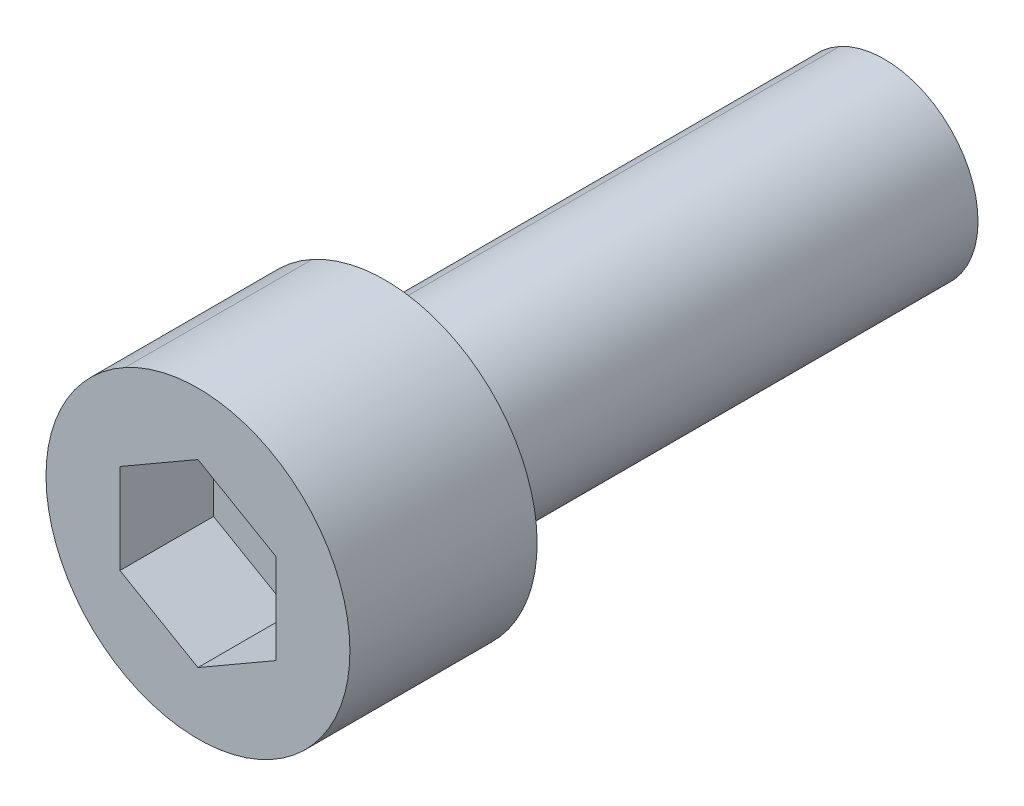
ISO-10303-21;
HEADER;
FILE_DESCRIPTION(('STEP AP214'),'2;1');
FILE_NAME('part.step','',(''),(''),'','','');
FILE_SCHEMA(('AUTOMOTIVE_DESIGN { 1 0 10303 214 1 1 1 1 }'));
ENDSEC;
DATA;
#1=APPLICATION_CONTEXT('core data for automotive mechanical design processes');
#2=APPLICATION_PROTOCOL_DEFINITION('international standard','automotive_design',2000,#1);
#3=PRODUCT_CONTEXT('',#1,'mechanical');
#4=PRODUCT('Part','Part','',(#3));
#5=PRODUCT_RELATED_PRODUCT_CATEGORY('part','',(#4));
#6=PRODUCT_DEFINITION_FORMATION('','',#4);
#7=PRODUCT_DEFINITION_CONTEXT('part definition',#1,'design');
#8=PRODUCT_DEFINITION('design','',#6,#7);
#9=PRODUCT_DEFINITION_SHAPE('','',#8);
#10=(LENGTH_UNIT() NAMED_UNIT(*) SI_UNIT(.MILLI.,.METRE.));
#11=(NAMED_UNIT(*) PLANE_ANGLE_UNIT() SI_UNIT($,.RADIAN.));
#12=(NAMED_UNIT(*) SI_UNIT($,.STERADIAN.) SOLID_ANGLE_UNIT());
#13=UNCERTAINTY_MEASURE_WITH_UNIT(LENGTH_MEASURE(1.E-05),#10,'distance_accuracy_value','');
#14=(GEOMETRIC_REPRESENTATION_CONTEXT(3) GLOBAL_UNCERTAINTY_ASSIGNED_CONTEXT((#13)) GLOBAL_UNIT_ASSIGNED_CONTEXT((#10,
#11,#12)) REPRESENTATION_CONTEXT('',''));
#15=CARTESIAN_POINT('',(0.,0.,0.));
#16=DIRECTION('',(0.,0.,1.));
#17=DIRECTION('',(1.,0.,0.));
#18=AXIS2_PLACEMENT_3D('',#15,#16,#17);
#19=CARTESIAN_POINT('',(0.,0.,779.5));
#20=DIRECTION('',(0.,0.,1.));
#21=DIRECTION('',(1.,0.,0.));
#22=AXIS2_PLACEMENT_3D('',#19,#20,#21);
#23=PLANE('',#22);
#24=CARTESIAN_POINT('',(213.4677415,-218.0155742,779.5));
#25=DIRECTION('',(-0.866025399730553,0.500000007021536,0.));
#26=VECTOR('',#25,1.);
#27=LINE('',#24,#26);
#28=CARTESIAN_POINT('',(213.467741506874,-218.015574188094,779.5));
#29=VERTEX_POINT('',#28);
#30=CARTESIAN_POINT('',(210.967741501666,-216.5721984926,779.5));
#31=VERTEX_POINT('',#30);
#32=EDGE_CURVE('E126',#29,#31,#27,.T.);
#33=ORIENTED_EDGE('',*,*,#32,.T.);
#34=CARTESIAN_POINT('',(210.9677415,-216.5721985,779.5));
#35=DIRECTION('',(-0.866025399730553,-0.500000007021536,0.));
#36=VECTOR('',#35,1.);
#37=LINE('',#34,#36);
#38=CARTESIAN_POINT('',(208.467741494793,-218.01557419098,779.5));
#39=VERTEX_POINT('',#38);
#40=EDGE_CURVE('E262',#31,#39,#37,.T.);
#41=ORIENTED_EDGE('',*,*,#40,.T.);
#42=CARTESIAN_POINT('',(208.4677415,-218.0155742,779.5));
#43=DIRECTION('',(0.,-1.,0.));
#44=VECTOR('',#43,1.);
#45=LINE('',#42,#44);
#46=CARTESIAN_POINT('',(208.46774150025,-220.902325499568,779.5));
#47=VERTEX_POINT('',#46);
#48=EDGE_CURVE('E221',#39,#47,#45,.T.);
#49=ORIENTED_EDGE('',*,*,#48,.T.);
#50=CARTESIAN_POINT('',(208.4677415,-220.9023255,779.5));
#51=DIRECTION('',(0.866025399730553,-0.500000007021536,0.));
#52=VECTOR('',#51,1.);
#53=LINE('',#50,#52);
#54=CARTESIAN_POINT('',(210.967741501666,-222.345701188497,779.5));
#55=VERTEX_POINT('',#54);
#56=EDGE_CURVE('E111',#47,#55,#53,.T.);
#57=ORIENTED_EDGE('',*,*,#56,.T.);
#58=CARTESIAN_POINT('',(210.9677415,-222.3457012,779.5));
#59=DIRECTION('',(0.866025399730553,0.500000007021536,0.));
#60=VECTOR('',#59,1.);
#61=LINE('',#58,#60);
#62=CARTESIAN_POINT('',(213.467741501418,-220.902325502455,779.5));
#63=VERTEX_POINT('',#62);
#64=EDGE_CURVE('E104',#55,#63,#61,.T.);
#65=ORIENTED_EDGE('',*,*,#64,.T.);
#66=CARTESIAN_POINT('',(213.4677415,-220.9023255,779.5));
#67=DIRECTION('',(0.,1.,0.));
#68=VECTOR('',#67,1.);
#69=LINE('',#66,#68);
#70=EDGE_CURVE('E90',#63,#29,#69,.T.);
#71=ORIENTED_EDGE('',*,*,#70,.T.);
#72=EDGE_LOOP('',(#33,#41,#49,#57,#65,#71));
#73=FACE_BOUND('',#72,.T.);
#74=ADVANCED_FACE('F14',(#73),#23,.T.);
#75=CARTESIAN_POINT('',(0.,-344.147983525931,0.));
#76=DIRECTION('',(-0.499999999993262,0.866025403788329,0.));
#77=DIRECTION('',(0.,0.,1.));
#78=AXIS2_PLACEMENT_3D('',#75,#76,#77);
#79=PLANE('',#78);
#80=CARTESIAN_POINT('',(210.967741492538,-222.345701187075,782.5));
#81=DIRECTION('',(0.866025403788331,0.499999999993259,0.));
#82=VECTOR('',#81,1.);
#83=LINE('',#80,#82);
#84=CARTESIAN_POINT('',(210.967741501666,-222.345701188497,782.5));
#85=VERTEX_POINT('',#84);
#86=CARTESIAN_POINT('',(213.467741501418,-220.902325502455,782.5));
#87=VERTEX_POINT('',#86);
#88=EDGE_CURVE('E123',#85,#87,#83,.T.);
#89=ORIENTED_EDGE('',*,*,#88,.T.);
#90=CARTESIAN_POINT('',(213.467741504252,-220.902325507364,782.5));
#91=DIRECTION('',(0.,0.,-1.));
#92=VECTOR('',#91,1.);
#93=LINE('',#90,#92);
#94=EDGE_CURVE('E96',#87,#63,#93,.T.);
#95=ORIENTED_EDGE('',*,*,#94,.T.);
#96=ORIENTED_EDGE('',*,*,#64,.F.);
#97=CARTESIAN_POINT('',(210.967741492538,-222.345701187075,779.5));
#98=DIRECTION('',(0.,0.,1.));
#99=VECTOR('',#98,1.);
#100=LINE('',#97,#99);
#101=EDGE_CURVE('E155',#55,#85,#100,.T.);
#102=ORIENTED_EDGE('',*,*,#101,.T.);
#103=EDGE_LOOP('',(#89,#95,#96,#102));
#104=FACE_BOUND('',#103,.T.);
#105=ADVANCED_FACE('F122',(#104),#79,.T.);
#106=CARTESIAN_POINT('',(213.4677415,0.,0.));
#107=DIRECTION('',(-1.,0.,0.));
#108=DIRECTION('',(0.,0.,1.));
#109=AXIS2_PLACEMENT_3D('',#106,#107,#108);
#110=PLANE('',#109);
#111=CARTESIAN_POINT('',(213.4677415,-220.9023255,782.5));
#112=DIRECTION('',(0.,1.,0.));
#113=VECTOR('',#112,1.);
#114=LINE('',#111,#113);
#115=CARTESIAN_POINT('',(213.467741506874,-218.015574188094,782.5));
#116=VERTEX_POINT('',#115);
#117=EDGE_CURVE('E346',#87,#116,#114,.T.);
#118=ORIENTED_EDGE('',*,*,#117,.T.);
#119=CARTESIAN_POINT('',(213.4677415,-218.0155742,782.5));
#120=DIRECTION('',(0.,0.,-1.));
#121=VECTOR('',#120,1.);
#122=LINE('',#119,#121);
#123=EDGE_CURVE('E99',#116,#29,#122,.T.);
#124=ORIENTED_EDGE('',*,*,#123,.T.);
#125=ORIENTED_EDGE('',*,*,#70,.F.);
#126=ORIENTED_EDGE('',*,*,#94,.F.);
#127=EDGE_LOOP('',(#118,#124,#125,#126));
#128=FACE_BOUND('',#127,.T.);
#129=ADVANCED_FACE('F94',(#128),#110,.T.);
#130=CARTESIAN_POINT('',(0.,-94.7699161362638,0.));
#131=DIRECTION('',(-0.499999999993262,-0.866025403788329,0.));
#132=DIRECTION('',(0.,0.,1.));
#133=AXIS2_PLACEMENT_3D('',#130,#131,#132);
#134=PLANE('',#133);
#135=CARTESIAN_POINT('',(213.467741520622,-218.015574164282,782.5));
#136=DIRECTION('',(-0.866025403788329,0.499999999993261,0.));
#137=VECTOR('',#136,1.);
#138=LINE('',#135,#137);
#139=CARTESIAN_POINT('',(210.967741501666,-216.5721984926,782.5));
#140=VERTEX_POINT('',#139);
#141=EDGE_CURVE('E327',#116,#140,#138,.T.);
#142=ORIENTED_EDGE('',*,*,#141,.T.);
#143=CARTESIAN_POINT('',(210.967741508908,-216.572198484571,782.5));
#144=DIRECTION('',(0.,0.,-1.));
#145=VECTOR('',#144,1.);
#146=LINE('',#143,#145);
#147=EDGE_CURVE('E295',#140,#31,#146,.T.);
#148=ORIENTED_EDGE('',*,*,#147,.T.);
#149=ORIENTED_EDGE('',*,*,#32,.F.);
#150=ORIENTED_EDGE('',*,*,#123,.F.);
#151=EDGE_LOOP('',(#142,#148,#149,#150));
#152=FACE_BOUND('',#151,.T.);
#153=ADVANCED_FACE('F275',(#152),#134,.T.);
#154=CARTESIAN_POINT('',(0.,-338.374480834138,0.));
#155=DIRECTION('',(0.499999999993262,-0.866025403788329,0.));
#156=DIRECTION('',(0.,0.,-1.));
#157=AXIS2_PLACEMENT_3D('',#154,#155,#156);
#158=PLANE('',#157);
#159=CARTESIAN_POINT('',(210.967741496092,-216.572198493231,782.5));
#160=DIRECTION('',(-0.866025403788327,-0.499999999993266,0.));
#161=VECTOR('',#160,1.);
#162=LINE('',#159,#161);
#163=CARTESIAN_POINT('',(208.467741494793,-218.01557419098,782.5));
#164=VERTEX_POINT('',#163);
#165=EDGE_CURVE('E348',#140,#164,#162,.T.);
#166=ORIENTED_EDGE('',*,*,#165,.T.);
#167=CARTESIAN_POINT('',(208.467741484378,-218.015574172942,782.5));
#168=DIRECTION('',(0.,0.,-1.));
#169=VECTOR('',#168,1.);
#170=LINE('',#167,#169);
#171=EDGE_CURVE('E251',#164,#39,#170,.T.);
#172=ORIENTED_EDGE('',*,*,#171,.T.);
#173=ORIENTED_EDGE('',*,*,#40,.F.);
#174=ORIENTED_EDGE('',*,*,#147,.F.);
#175=EDGE_LOOP('',(#166,#172,#173,#174));
#176=FACE_BOUND('',#175,.T.);
#177=ADVANCED_FACE('F267',(#176),#158,.T.);
#178=CARTESIAN_POINT('',(208.4677415,0.,0.));
#179=DIRECTION('',(1.,0.,0.));
#180=DIRECTION('',(0.,0.,-1.));
#181=AXIS2_PLACEMENT_3D('',#178,#179,#180);
#182=PLANE('',#181);
#183=CARTESIAN_POINT('',(208.4677415,-218.0155742,782.5));
#184=DIRECTION('',(0.,-1.,0.));
#185=VECTOR('',#184,1.);
#186=LINE('',#183,#185);
#187=CARTESIAN_POINT('',(208.46774150025,-220.902325499568,782.5));
#188=VERTEX_POINT('',#187);
#189=EDGE_CURVE('E180',#164,#188,#186,.T.);
#190=ORIENTED_EDGE('',*,*,#189,.T.);
#191=CARTESIAN_POINT('',(208.4677415,-220.9023255,782.5));
#192=DIRECTION('',(0.,0.,-1.));
#193=VECTOR('',#192,1.);
#194=LINE('',#191,#193);
#195=EDGE_CURVE('E167',#188,#47,#194,.T.);
#196=ORIENTED_EDGE('',*,*,#195,.T.);
#197=ORIENTED_EDGE('',*,*,#48,.F.);
#198=ORIENTED_EDGE('',*,*,#171,.F.);
#199=EDGE_LOOP('',(#190,#196,#197,#198));
#200=FACE_BOUND('',#199,.T.);
#201=ADVANCED_FACE('F199',(#200),#182,.T.);
#202=CARTESIAN_POINT('',(0.,-100.543418828056,0.));
#203=DIRECTION('',(0.499999999993262,0.866025403788329,0.));
#204=DIRECTION('',(0.,0.,-1.));
#205=AXIS2_PLACEMENT_3D('',#202,#203,#204);
#206=PLANE('',#205);
#207=CARTESIAN_POINT('',(208.467741500748,-220.902325498704,782.5));
#208=DIRECTION('',(0.866025403788328,-0.499999999993263,0.));
#209=VECTOR('',#208,1.);
#210=LINE('',#207,#209);
#211=EDGE_CURVE('E169',#188,#85,#210,.T.);
#212=ORIENTED_EDGE('',*,*,#211,.T.);
#213=ORIENTED_EDGE('',*,*,#101,.F.);
#214=ORIENTED_EDGE('',*,*,#56,.F.);
#215=ORIENTED_EDGE('',*,*,#195,.F.);
#216=EDGE_LOOP('',(#212,#213,#214,#215));
#217=FACE_BOUND('',#216,.T.);
#218=ADVANCED_FACE('F171',(#217),#206,.T.);
#219=CARTESIAN_POINT('',(0.,0.,782.5));
#220=DIRECTION('',(0.,0.,1.));
#221=DIRECTION('',(1.,0.,0.));
#222=AXIS2_PLACEMENT_3D('',#219,#220,#221);
#223=PLANE('',#222);
#224=ORIENTED_EDGE('',*,*,#189,.F.);
#225=ORIENTED_EDGE('',*,*,#165,.F.);
#226=ORIENTED_EDGE('',*,*,#141,.F.);
#227=ORIENTED_EDGE('',*,*,#117,.F.);
#228=ORIENTED_EDGE('',*,*,#88,.F.);
#229=ORIENTED_EDGE('',*,*,#211,.F.);
#230=EDGE_LOOP('',(#224,#225,#226,#227,#228,#229));
#231=FACE_BOUND('',#230,.T.);
#232=CARTESIAN_POINT('',(210.9677415,-219.4589499,782.5));
#233=DIRECTION('',(0.,0.,-1.));
#234=DIRECTION('',(0.479425538596923,-0.87758256189435,0.));
#235=AXIS2_PLACEMENT_3D('',#232,#233,#234);
#236=CIRCLE('',#235,4.86999998570629);
#237=CARTESIAN_POINT('',(208.632939171016,-215.185122825516,782.5));
#238=VERTEX_POINT('',#237);
#239=CARTESIAN_POINT('',(213.302543888528,-223.732776941955,782.5));
#240=VERTEX_POINT('',#239);
#241=EDGE_CURVE('E727',#238,#240,#236,.F.);
#242=ORIENTED_EDGE('',*,*,#241,.T.);
#243=CARTESIAN_POINT('',(210.9677415,-219.4589499,782.5));
#244=DIRECTION('',(0.,0.,-1.));
#245=DIRECTION('',(-0.479425538596918,0.877582561894353,0.));
#246=AXIS2_PLACEMENT_3D('',#243,#244,#245);
#247=CIRCLE('',#246,4.86999994589062);
#248=EDGE_CURVE('E179',#240,#238,#247,.F.);
#249=ORIENTED_EDGE('',*,*,#248,.T.);
#250=EDGE_LOOP('',(#242,#249));
#251=FACE_BOUND('',#250,.T.);
#252=ADVANCED_FACE('F198',(#231,#251),#223,.T.);
#253=CARTESIAN_POINT('',(213.3025439,-223.7327769,776.5));
#254=CARTESIAN_POINT('',(213.3025439,-223.7327769,782.5));
#255=(BOUNDED_CURVE() B_SPLINE_CURVE(1,(#253,#254),.UNSPECIFIED.,.F.,
.F.) B_SPLINE_CURVE_WITH_KNOTS((2,2),(0.,1.),
.UNSPECIFIED.) CURVE() GEOMETRIC_REPRESENTATION_ITEM() RATIONAL_B_SPLINE_CURVE((1.,1.)) REPRESENTATION_ITEM(''));
#256=CARTESIAN_POINT('',(210.9677415,-219.4589499,771.5));
#257=DIRECTION('',(0.,0.,1.));
#258=AXIS1_PLACEMENT('',#256,#257);
#259=SURFACE_OF_REVOLUTION('',#255,#258);
#260=ORIENTED_EDGE('',*,*,#248,.F.);
#261=CARTESIAN_POINT('',(213.3025439,-223.7327769,782.5));
#262=CARTESIAN_POINT('',(213.3025439,-223.7327769,782.25));
#263=CARTESIAN_POINT('',(213.3025439,-223.7327769,782.));
#264=CARTESIAN_POINT('',(213.3025439,-223.7327769,781.5));
#265=CARTESIAN_POINT('',(213.3025439,-223.7327769,781.25));
#266=CARTESIAN_POINT('',(213.3025439,-223.7327769,780.75));
#267=CARTESIAN_POINT('',(213.3025439,-223.7327769,780.5));
#268=CARTESIAN_POINT('',(213.3025439,-223.7327769,780.));
#269=CARTESIAN_POINT('',(213.3025439,-223.7327769,779.75));
#270=CARTESIAN_POINT('',(213.3025439,-223.7327769,779.25));
#271=CARTESIAN_POINT('',(213.3025439,-223.7327769,779.));
#272=CARTESIAN_POINT('',(213.3025439,-223.7327769,778.5));
#273=CARTESIAN_POINT('',(213.3025439,-223.7327769,778.25));
#274=CARTESIAN_POINT('',(213.3025439,-223.7327769,777.75));
#275=CARTESIAN_POINT('',(213.3025439,-223.7327769,777.5));
#276=CARTESIAN_POINT('',(213.3025439,-223.7327769,777.));
#277=CARTESIAN_POINT('',(213.3025439,-223.7327769,776.75));
#278=CARTESIAN_POINT('',(213.3025439,-223.7327769,776.5));
#279=B_SPLINE_CURVE_WITH_KNOTS('',3,(#261,#262,#263,#264,#265,#266,#267,#268,#269,#270,#271,
#272,#273,#274,#275,#276,#277,#278),.UNSPECIFIED.,.F.,.F.,(4,2,2,2,2,2,2,2,4),(0.,
0.750000000000028,1.49999999999995,2.25000000000009,3.,3.74999999999992,4.49999999999995,
5.25000000000009,6.00000000000001),.UNSPECIFIED.);
#280=CARTESIAN_POINT('',(213.302543888528,-223.732776941955,776.5));
#281=VERTEX_POINT('',#280);
#282=EDGE_CURVE('E695',#240,#281,#279,.T.);
#283=ORIENTED_EDGE('',*,*,#282,.T.);
#284=CARTESIAN_POINT('',(210.9677415,-219.4589499,776.5));
#285=DIRECTION('',(0.,0.,1.));
#286=DIRECTION('',(0.479425549474623,-0.877582555951835,0.));
#287=AXIS2_PLACEMENT_3D('',#284,#285,#286);
#288=CIRCLE('',#287,4.86999994589064);
#289=CARTESIAN_POINT('',(208.632939171016,-215.185122825516,776.5));
#290=VERTEX_POINT('',#289);
#291=EDGE_CURVE('E687',#281,#290,#288,.T.);
#292=ORIENTED_EDGE('',*,*,#291,.T.);
#293=CARTESIAN_POINT('',(208.632939219089,-215.185122834942,776.5));
#294=CARTESIAN_POINT('',(208.632939219089,-215.185122834942,776.75));
#295=CARTESIAN_POINT('',(208.632939219089,-215.185122834942,777.));
#296=CARTESIAN_POINT('',(208.632939219089,-215.185122834942,777.5));
#297=CARTESIAN_POINT('',(208.632939219089,-215.185122834942,777.75));
#298=CARTESIAN_POINT('',(208.632939219089,-215.185122834942,778.25));
#299=CARTESIAN_POINT('',(208.632939219089,-215.185122834942,778.5));
#300=CARTESIAN_POINT('',(208.632939219089,-215.185122834942,779.));
#301=CARTESIAN_POINT('',(208.632939219089,-215.185122834942,779.25));
#302=CARTESIAN_POINT('',(208.632939219089,-215.185122834942,779.75));
#303=CARTESIAN_POINT('',(208.632939219089,-215.185122834942,780.));
#304=CARTESIAN_POINT('',(208.632939219089,-215.185122834942,780.5));
#305=CARTESIAN_POINT('',(208.632939219089,-215.185122834942,780.75));
#306=CARTESIAN_POINT('',(208.632939219089,-215.185122834942,781.25));
#307=CARTESIAN_POINT('',(208.632939219089,-215.185122834942,781.5));
#308=CARTESIAN_POINT('',(208.632939219089,-215.185122834942,782.));
#309=CARTESIAN_POINT('',(208.632939219089,-215.185122834942,782.25));
#310=CARTESIAN_POINT('',(208.632939219089,-215.185122834942,782.5));
#311=B_SPLINE_CURVE_WITH_KNOTS('',3,(#293,#294,#295,#296,#297,#298,#299,#300,#301,#302,#303,
#304,#305,#306,#307,#308,#309,#310),.UNSPECIFIED.,.F.,.F.,(4,2,2,2,2,2,2,2,4),(0.,
0.749999999999917,1.50000000000006,2.25000000000009,3.,3.74999999999992,4.50000000000006,
5.24999999999998,6.00000000000001),.UNSPECIFIED.);
#312=EDGE_CURVE('E736',#290,#238,#311,.T.);
#313=ORIENTED_EDGE('',*,*,#312,.T.);
#314=EDGE_LOOP('',(#260,#283,#292,#313));
#315=FACE_BOUND('',#314,.T.);
#316=ADVANCED_FACE('F535',(#315),#259,.T.);
#317=CARTESIAN_POINT('',(208.6329392,-215.1851228,776.5));
#318=CARTESIAN_POINT('',(208.6329392,-215.1851228,782.5));
#319=(BOUNDED_CURVE() B_SPLINE_CURVE(1,(#317,#318),.UNSPECIFIED.,.F.,
.F.) B_SPLINE_CURVE_WITH_KNOTS((2,2),(0.,1.),
.UNSPECIFIED.) CURVE() GEOMETRIC_REPRESENTATION_ITEM() RATIONAL_B_SPLINE_CURVE((1.,1.)) REPRESENTATION_ITEM(''));
#320=CARTESIAN_POINT('',(210.9677415,-219.4589499,771.5));
#321=DIRECTION('',(0.,0.,1.));
#322=AXIS1_PLACEMENT('',#320,#321);
#323=SURFACE_OF_REVOLUTION('',#319,#322);
#324=ORIENTED_EDGE('',*,*,#241,.F.);
#325=ORIENTED_EDGE('',*,*,#312,.F.);
#326=CARTESIAN_POINT('',(210.9677415,-219.4589499,776.5));
#327=DIRECTION('',(0.,0.,1.));
#328=DIRECTION('',(-0.479425525021101,0.877582569310855,0.));
#329=AXIS2_PLACEMENT_3D('',#326,#327,#328);
#330=CIRCLE('',#329,4.8699999857063);
#331=EDGE_CURVE('E670',#290,#281,#330,.T.);
#332=ORIENTED_EDGE('',*,*,#331,.T.);
#333=ORIENTED_EDGE('',*,*,#282,.F.);
#334=EDGE_LOOP('',(#324,#325,#332,#333));
#335=FACE_BOUND('',#334,.T.);
#336=ADVANCED_FACE('F547',(#335),#323,.T.);
#337=CARTESIAN_POINT('',(0.,0.,760.5));
#338=DIRECTION('',(0.,0.,1.));
#339=DIRECTION('',(1.,0.,0.));
#340=AXIS2_PLACEMENT_3D('',#337,#338,#339);
#341=PLANE('',#340);
#342=CARTESIAN_POINT('',(210.9677415,-219.4589499,760.5));
#343=DIRECTION('',(0.,0.,1.));
#344=DIRECTION('',(-0.479425532535284,0.877582565205838,0.));
#345=AXIS2_PLACEMENT_3D('',#342,#343,#344);
#346=CIRCLE('',#345,3.00000000499381);
#347=CARTESIAN_POINT('',(212.406018161479,-222.091697549401,760.5));
#348=VERTEX_POINT('',#347);
#349=CARTESIAN_POINT('',(209.529464898065,-216.82620221807,760.5));
#350=VERTEX_POINT('',#349);
#351=EDGE_CURVE('E659',#348,#350,#346,.F.);
#352=ORIENTED_EDGE('',*,*,#351,.T.);
#353=CARTESIAN_POINT('',(210.9677415,-219.4589499,760.5));
#354=DIRECTION('',(0.,0.,1.));
#355=DIRECTION('',(0.479425572231494,-0.877582543519699,0.));
#356=AXIS2_PLACEMENT_3D('',#353,#354,#355);
#357=CIRCLE('',#356,2.99999996517814);
#358=EDGE_CURVE('E660',#350,#348,#357,.F.);
#359=ORIENTED_EDGE('',*,*,#358,.T.);
#360=EDGE_LOOP('',(#352,#359));
#361=FACE_BOUND('',#360,.T.);
#362=ADVANCED_FACE('F559',(#361),#341,.F.);
#363=CARTESIAN_POINT('',(0.,0.,776.5));
#364=DIRECTION('',(0.,0.,1.));
#365=DIRECTION('',(1.,0.,0.));
#366=AXIS2_PLACEMENT_3D('',#363,#364,#365);
#367=PLANE('',#366);
#368=CARTESIAN_POINT('',(210.9677415,-219.4589499,776.5));
#369=DIRECTION('',(0.,0.,-1.));
#370=DIRECTION('',(0.479425538596918,-0.877582561894352,0.));
#371=AXIS2_PLACEMENT_3D('',#368,#369,#370);
#372=CIRCLE('',#371,3.00000000499379);
#373=CARTESIAN_POINT('',(209.529464898065,-216.82620221807,776.5));
#374=VERTEX_POINT('',#373);
#375=CARTESIAN_POINT('',(212.406018161479,-222.091697549401,776.5));
#376=VERTEX_POINT('',#375);
#377=EDGE_CURVE('E26',#374,#376,#372,.F.);
#378=ORIENTED_EDGE('',*,*,#377,.T.);
#379=CARTESIAN_POINT('',(210.9677415,-219.4589499,776.5));
#380=DIRECTION('',(0.,0.,-1.));
#381=DIRECTION('',(-0.47942553859691,0.877582561894357,0.));
#382=AXIS2_PLACEMENT_3D('',#379,#380,#381);
#383=CIRCLE('',#382,2.99999996517813);
#384=EDGE_CURVE('E33',#376,#374,#383,.F.);
#385=ORIENTED_EDGE('',*,*,#384,.T.);
#386=EDGE_LOOP('',(#378,#385));
#387=FACE_BOUND('',#386,.T.);
#388=ORIENTED_EDGE('',*,*,#291,.F.);
#389=ORIENTED_EDGE('',*,*,#331,.F.);
#390=EDGE_LOOP('',(#388,#389));
#391=FACE_BOUND('',#390,.T.);
#392=ADVANCED_FACE('F572',(#387,#391),#367,.F.);
#393=CARTESIAN_POINT('',(212.4060182,-222.0916975,760.5));
#394=CARTESIAN_POINT('',(212.4060182,-222.0916975,776.5));
#395=(BOUNDED_CURVE() B_SPLINE_CURVE(1,(#393,#394),.UNSPECIFIED.,.F.,
.F.) B_SPLINE_CURVE_WITH_KNOTS((2,2),(0.,1.),
.UNSPECIFIED.) CURVE() GEOMETRIC_REPRESENTATION_ITEM() RATIONAL_B_SPLINE_CURVE((1.,1.)) REPRESENTATION_ITEM(''));
#396=CARTESIAN_POINT('',(210.9677415,-219.4589499,771.5));
#397=DIRECTION('',(0.,0.,1.));
#398=AXIS1_PLACEMENT('',#396,#397);
#399=SURFACE_OF_REVOLUTION('',#395,#398);
#400=ORIENTED_EDGE('',*,*,#384,.F.);
#401=CARTESIAN_POINT('',(212.4060182,-222.0916975,776.5));
#402=CARTESIAN_POINT('',(212.4060182,-222.0916975,775.833333333333));
#403=CARTESIAN_POINT('',(212.4060182,-222.0916975,775.166666666667));
#404=CARTESIAN_POINT('',(212.4060182,-222.0916975,773.833333333333));
#405=CARTESIAN_POINT('',(212.4060182,-222.0916975,773.166666666667));
#406=CARTESIAN_POINT('',(212.4060182,-222.0916975,771.833333333333));
#407=CARTESIAN_POINT('',(212.4060182,-222.0916975,771.166666666667));
#408=CARTESIAN_POINT('',(212.4060182,-222.0916975,769.833333333333));
#409=CARTESIAN_POINT('',(212.4060182,-222.0916975,769.166666666667));
#410=CARTESIAN_POINT('',(212.4060182,-222.0916975,767.833333333333));
#411=CARTESIAN_POINT('',(212.4060182,-222.0916975,767.166666666667));
#412=CARTESIAN_POINT('',(212.4060182,-222.0916975,765.833333333333));
#413=CARTESIAN_POINT('',(212.4060182,-222.0916975,765.166666666667));
#414=CARTESIAN_POINT('',(212.4060182,-222.0916975,763.833333333333));
#415=CARTESIAN_POINT('',(212.4060182,-222.0916975,763.166666666667));
#416=CARTESIAN_POINT('',(212.4060182,-222.0916975,761.833333333333));
#417=CARTESIAN_POINT('',(212.4060182,-222.0916975,761.166666666667));
#418=CARTESIAN_POINT('',(212.4060182,-222.0916975,760.5));
#419=B_SPLINE_CURVE_WITH_KNOTS('',3,(#401,#402,#403,#404,#405,#406,#407,#408,#409,#410,#411,
#412,#413,#414,#415,#416,#417,#418),.UNSPECIFIED.,.F.,.F.,(4,2,2,2,2,2,2,2,4),(0.,2.,4.,
6.00000000000001,8.00000000000001,10.,12.,14.,16.),.UNSPECIFIED.);
#420=EDGE_CURVE('E9',#376,#348,#419,.T.);
#421=ORIENTED_EDGE('',*,*,#420,.T.);
#422=ORIENTED_EDGE('',*,*,#358,.F.);
#423=CARTESIAN_POINT('',(209.529464919089,-216.826202234942,760.5));
#424=CARTESIAN_POINT('',(209.529464919089,-216.826202234942,761.166666666667));
#425=CARTESIAN_POINT('',(209.529464919089,-216.826202234942,761.833333333333));
#426=CARTESIAN_POINT('',(209.529464919089,-216.826202234942,763.166666666667));
#427=CARTESIAN_POINT('',(209.529464919089,-216.826202234942,763.833333333333));
#428=CARTESIAN_POINT('',(209.529464919089,-216.826202234942,765.166666666667));
#429=CARTESIAN_POINT('',(209.529464919089,-216.826202234942,765.833333333333));
#430=CARTESIAN_POINT('',(209.529464919089,-216.826202234942,767.166666666667));
#431=CARTESIAN_POINT('',(209.529464919089,-216.826202234942,767.833333333333));
#432=CARTESIAN_POINT('',(209.529464919089,-216.826202234942,769.166666666667));
#433=CARTESIAN_POINT('',(209.529464919089,-216.826202234942,769.833333333333));
#434=CARTESIAN_POINT('',(209.529464919089,-216.826202234942,771.166666666667));
#435=CARTESIAN_POINT('',(209.529464919089,-216.826202234942,771.833333333333));
#436=CARTESIAN_POINT('',(209.529464919089,-216.826202234942,773.166666666667));
#437=CARTESIAN_POINT('',(209.529464919089,-216.826202234942,773.833333333333));
#438=CARTESIAN_POINT('',(209.529464919089,-216.826202234942,775.166666666667));
#439=CARTESIAN_POINT('',(209.529464919089,-216.826202234942,775.833333333333));
#440=CARTESIAN_POINT('',(209.529464919089,-216.826202234942,776.5));
#441=B_SPLINE_CURVE_WITH_KNOTS('',3,(#423,#424,#425,#426,#427,#428,#429,#430,#431,#432,#433,
#434,#435,#436,#437,#438,#439,#440),.UNSPECIFIED.,.F.,.F.,(4,2,2,2,2,2,2,2,4),(0.,2.,4.,
6.00000000000001,8.00000000000001,10.,12.,14.,16.),.UNSPECIFIED.);
#442=EDGE_CURVE('E703',#350,#374,#441,.T.);
#443=ORIENTED_EDGE('',*,*,#442,.T.);
#444=EDGE_LOOP('',(#400,#421,#422,#443));
#445=FACE_BOUND('',#444,.T.);
#446=ADVANCED_FACE('F585',(#445),#399,.T.);
#447=CARTESIAN_POINT('',(209.5294649,-216.8262022,760.5));
#448=CARTESIAN_POINT('',(209.5294649,-216.8262022,776.5));
#449=(BOUNDED_CURVE() B_SPLINE_CURVE(1,(#447,#448),.UNSPECIFIED.,.F.,
.F.) B_SPLINE_CURVE_WITH_KNOTS((2,2),(0.,1.),
.UNSPECIFIED.) CURVE() GEOMETRIC_REPRESENTATION_ITEM() RATIONAL_B_SPLINE_CURVE((1.,1.)) REPRESENTATION_ITEM(''));
#450=CARTESIAN_POINT('',(210.9677415,-219.4589499,771.5));
#451=DIRECTION('',(0.,0.,1.));
#452=AXIS1_PLACEMENT('',#450,#451);
#453=SURFACE_OF_REVOLUTION('',#449,#452);
#454=ORIENTED_EDGE('',*,*,#377,.F.);
#455=ORIENTED_EDGE('',*,*,#442,.F.);
#456=ORIENTED_EDGE('',*,*,#351,.F.);
#457=ORIENTED_EDGE('',*,*,#420,.F.);
#458=EDGE_LOOP('',(#454,#455,#456,#457));
#459=FACE_BOUND('',#458,.T.);
#460=ADVANCED_FACE('F599',(#459),#453,.T.);
#461=CLOSED_SHELL('',(#74,#105,#129,#153,#177,#201,#218,#252,#316,#336,#362,#392,#446,#460));
#462=MANIFOLD_SOLID_BREP('B1',#461);
#463=ADVANCED_BREP_SHAPE_REPRESENTATION('',(#18,#462),#14);
#464=SHAPE_DEFINITION_REPRESENTATION(#9,#463);
ENDSEC;
END-ISO-10303-21;
